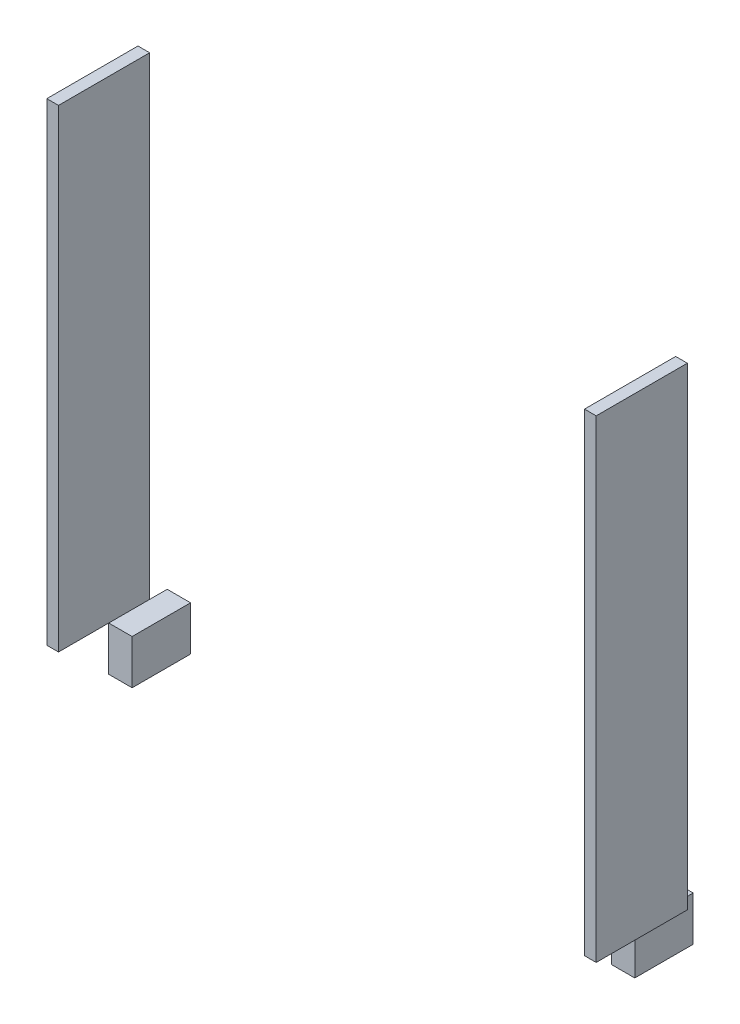
ISO-10303-21;
HEADER;
FILE_DESCRIPTION(('STEP AP214'),'2;1');
FILE_NAME('part.step','',(''),(''),'','','');
FILE_SCHEMA(('AUTOMOTIVE_DESIGN { 1 0 10303 214 1 1 1 1 }'));
ENDSEC;
DATA;
#1=APPLICATION_CONTEXT('core data for automotive mechanical design processes');
#2=APPLICATION_PROTOCOL_DEFINITION('international standard','automotive_design',2000,#1);
#3=PRODUCT_CONTEXT('',#1,'mechanical');
#4=PRODUCT('Part','Part','',(#3));
#5=PRODUCT_RELATED_PRODUCT_CATEGORY('part','',(#4));
#6=PRODUCT_DEFINITION_FORMATION('','',#4);
#7=PRODUCT_DEFINITION_CONTEXT('part definition',#1,'design');
#8=PRODUCT_DEFINITION('design','',#6,#7);
#9=PRODUCT_DEFINITION_SHAPE('','',#8);
#10=(LENGTH_UNIT() NAMED_UNIT(*) SI_UNIT(.MILLI.,.METRE.));
#11=(NAMED_UNIT(*) PLANE_ANGLE_UNIT() SI_UNIT($,.RADIAN.));
#12=(NAMED_UNIT(*) SI_UNIT($,.STERADIAN.) SOLID_ANGLE_UNIT());
#13=UNCERTAINTY_MEASURE_WITH_UNIT(LENGTH_MEASURE(1.E-05),#10,'distance_accuracy_value','');
#14=(GEOMETRIC_REPRESENTATION_CONTEXT(3) GLOBAL_UNCERTAINTY_ASSIGNED_CONTEXT((#13)) GLOBAL_UNIT_ASSIGNED_CONTEXT((#10,
#11,#12)) REPRESENTATION_CONTEXT('',''));
#15=CARTESIAN_POINT('',(0.,0.,0.));
#16=DIRECTION('',(0.,0.,1.));
#17=DIRECTION('',(1.,0.,0.));
#18=AXIS2_PLACEMENT_3D('',#15,#16,#17);
#19=CARTESIAN_POINT('',(205.,2.,335.));
#20=DIRECTION('',(1.,0.,0.));
#21=DIRECTION('',(0.,0.,-1.));
#22=AXIS2_PLACEMENT_3D('',#19,#20,#21);
#23=PLANE('',#22);
#24=DIRECTION('',(0.,-1.,0.));
#25=VECTOR('',#24,1.);
#26=CARTESIAN_POINT('',(205.,2.,285.));
#27=LINE('',#26,#25);
#28=CARTESIAN_POINT('',(205.,40.,285.));
#29=VERTEX_POINT('',#28);
#30=CARTESIAN_POINT('',(205.,2.,285.));
#31=VERTEX_POINT('',#30);
#32=EDGE_CURVE('E123',#29,#31,#27,.T.);
#33=ORIENTED_EDGE('',*,*,#32,.T.);
#34=DIRECTION('',(0.,0.,-1.));
#35=VECTOR('',#34,1.);
#36=CARTESIAN_POINT('',(205.,2.,335.));
#37=LINE('',#36,#35);
#38=CARTESIAN_POINT('',(205.,2.,335.));
#39=VERTEX_POINT('',#38);
#40=EDGE_CURVE('E12',#39,#31,#37,.T.);
#41=ORIENTED_EDGE('',*,*,#40,.F.);
#42=DIRECTION('',(0.,-1.,0.));
#43=VECTOR('',#42,1.);
#44=CARTESIAN_POINT('',(205.,2.,335.));
#45=LINE('',#44,#43);
#46=CARTESIAN_POINT('',(205.,40.,335.));
#47=VERTEX_POINT('',#46);
#48=EDGE_CURVE('E106',#47,#39,#45,.T.);
#49=ORIENTED_EDGE('',*,*,#48,.F.);
#50=DIRECTION('',(0.,0.,-1.));
#51=VECTOR('',#50,1.);
#52=CARTESIAN_POINT('',(205.,40.,335.));
#53=LINE('',#52,#51);
#54=EDGE_CURVE('E118',#47,#29,#53,.T.);
#55=ORIENTED_EDGE('',*,*,#54,.T.);
#56=EDGE_LOOP('',(#33,#41,#49,#55));
#57=FACE_BOUND('',#56,.T.);
#58=ADVANCED_FACE('F53',(#57),#23,.F.);
#59=CARTESIAN_POINT('',(205.,2.,335.));
#60=DIRECTION('',(0.,1.,0.));
#61=DIRECTION('',(0.,0.,1.));
#62=AXIS2_PLACEMENT_3D('',#59,#60,#61);
#63=PLANE('',#62);
#64=DIRECTION('',(1.,0.,0.));
#65=VECTOR('',#64,1.);
#66=CARTESIAN_POINT('',(205.,2.,285.));
#67=LINE('',#66,#65);
#68=CARTESIAN_POINT('',(225.,2.,285.));
#69=VERTEX_POINT('',#68);
#70=EDGE_CURVE('E112',#31,#69,#67,.T.);
#71=ORIENTED_EDGE('',*,*,#70,.T.);
#72=DIRECTION('',(0.,0.,-1.));
#73=VECTOR('',#72,1.);
#74=CARTESIAN_POINT('',(225.,2.,335.));
#75=LINE('',#74,#73);
#76=CARTESIAN_POINT('',(225.,2.,335.));
#77=VERTEX_POINT('',#76);
#78=EDGE_CURVE('E64',#77,#69,#75,.T.);
#79=ORIENTED_EDGE('',*,*,#78,.F.);
#80=DIRECTION('',(1.,0.,0.));
#81=VECTOR('',#80,1.);
#82=CARTESIAN_POINT('',(205.,2.,335.));
#83=LINE('',#82,#81);
#84=EDGE_CURVE('E101',#39,#77,#83,.T.);
#85=ORIENTED_EDGE('',*,*,#84,.F.);
#86=ORIENTED_EDGE('',*,*,#40,.T.);
#87=EDGE_LOOP('',(#71,#79,#85,#86));
#88=FACE_BOUND('',#87,.T.);
#89=ADVANCED_FACE('F109',(#88),#63,.F.);
#90=CARTESIAN_POINT('',(225.,2.,335.));
#91=DIRECTION('',(-1.,0.,0.));
#92=DIRECTION('',(0.,0.,1.));
#93=AXIS2_PLACEMENT_3D('',#90,#91,#92);
#94=PLANE('',#93);
#95=DIRECTION('',(0.,1.,0.));
#96=VECTOR('',#95,1.);
#97=CARTESIAN_POINT('',(225.,2.,285.));
#98=LINE('',#97,#96);
#99=CARTESIAN_POINT('',(225.,40.,285.));
#100=VERTEX_POINT('',#99);
#101=EDGE_CURVE('E86',#69,#100,#98,.T.);
#102=ORIENTED_EDGE('',*,*,#101,.T.);
#103=DIRECTION('',(0.,0.,-1.));
#104=VECTOR('',#103,1.);
#105=CARTESIAN_POINT('',(225.,40.,335.));
#106=LINE('',#105,#104);
#107=CARTESIAN_POINT('',(225.,40.,335.));
#108=VERTEX_POINT('',#107);
#109=EDGE_CURVE('E114',#108,#100,#106,.T.);
#110=ORIENTED_EDGE('',*,*,#109,.F.);
#111=DIRECTION('',(0.,1.,0.));
#112=VECTOR('',#111,1.);
#113=CARTESIAN_POINT('',(225.,2.,335.));
#114=LINE('',#113,#112);
#115=EDGE_CURVE('E102',#77,#108,#114,.T.);
#116=ORIENTED_EDGE('',*,*,#115,.F.);
#117=ORIENTED_EDGE('',*,*,#78,.T.);
#118=EDGE_LOOP('',(#102,#110,#116,#117));
#119=FACE_BOUND('',#118,.T.);
#120=ADVANCED_FACE('F111',(#119),#94,.F.);
#121=CARTESIAN_POINT('',(205.,40.,335.));
#122=DIRECTION('',(0.,-1.,0.));
#123=DIRECTION('',(0.,0.,-1.));
#124=AXIS2_PLACEMENT_3D('',#121,#122,#123);
#125=PLANE('',#124);
#126=DIRECTION('',(-1.,0.,0.));
#127=VECTOR('',#126,1.);
#128=CARTESIAN_POINT('',(205.,40.,285.));
#129=LINE('',#128,#127);
#130=EDGE_CURVE('E94',#100,#29,#129,.T.);
#131=ORIENTED_EDGE('',*,*,#130,.T.);
#132=ORIENTED_EDGE('',*,*,#54,.F.);
#133=DIRECTION('',(-1.,0.,0.));
#134=VECTOR('',#133,1.);
#135=CARTESIAN_POINT('',(205.,40.,335.));
#136=LINE('',#135,#134);
#137=EDGE_CURVE('E72',#108,#47,#136,.T.);
#138=ORIENTED_EDGE('',*,*,#137,.F.);
#139=ORIENTED_EDGE('',*,*,#109,.T.);
#140=EDGE_LOOP('',(#131,#132,#138,#139));
#141=FACE_BOUND('',#140,.T.);
#142=ADVANCED_FACE('F135',(#141),#125,.F.);
#143=CARTESIAN_POINT('',(0.,0.,335.));
#144=DIRECTION('',(0.,0.,-1.));
#145=DIRECTION('',(-1.,0.,0.));
#146=AXIS2_PLACEMENT_3D('',#143,#144,#145);
#147=PLANE('',#146);
#148=ORIENTED_EDGE('',*,*,#48,.T.);
#149=ORIENTED_EDGE('',*,*,#84,.T.);
#150=ORIENTED_EDGE('',*,*,#115,.T.);
#151=ORIENTED_EDGE('',*,*,#137,.T.);
#152=EDGE_LOOP('',(#148,#149,#150,#151));
#153=FACE_BOUND('',#152,.T.);
#154=ADVANCED_FACE('F105',(#153),#147,.F.);
#155=CARTESIAN_POINT('',(0.,0.,285.));
#156=DIRECTION('',(0.,0.,-1.));
#157=DIRECTION('',(-1.,0.,0.));
#158=AXIS2_PLACEMENT_3D('',#155,#156,#157);
#159=PLANE('',#158);
#160=ORIENTED_EDGE('',*,*,#32,.F.);
#161=ORIENTED_EDGE('',*,*,#130,.F.);
#162=ORIENTED_EDGE('',*,*,#101,.F.);
#163=ORIENTED_EDGE('',*,*,#70,.F.);
#164=EDGE_LOOP('',(#160,#161,#162,#163));
#165=FACE_BOUND('',#164,.T.);
#166=ADVANCED_FACE('F138',(#165),#159,.T.);
#167=CLOSED_SHELL('',(#58,#89,#120,#142,#154,#166));
#168=MANIFOLD_SOLID_BREP('B2',#167);
#169=CARTESIAN_POINT('',(-225.,2.,335.));
#170=DIRECTION('',(1.,0.,0.));
#171=DIRECTION('',(0.,0.,-1.));
#172=AXIS2_PLACEMENT_3D('',#169,#170,#171);
#173=PLANE('',#172);
#174=DIRECTION('',(0.,-1.,0.));
#175=VECTOR('',#174,1.);
#176=CARTESIAN_POINT('',(-225.,2.,285.));
#177=LINE('',#176,#175);
#178=CARTESIAN_POINT('',(-225.,40.,285.));
#179=VERTEX_POINT('',#178);
#180=CARTESIAN_POINT('',(-225.,2.,285.));
#181=VERTEX_POINT('',#180);
#182=EDGE_CURVE('E277',#179,#181,#177,.T.);
#183=ORIENTED_EDGE('',*,*,#182,.T.);
#184=DIRECTION('',(0.,0.,-1.));
#185=VECTOR('',#184,1.);
#186=CARTESIAN_POINT('',(-225.,2.,335.));
#187=LINE('',#186,#185);
#188=CARTESIAN_POINT('',(-225.,2.,335.));
#189=VERTEX_POINT('',#188);
#190=EDGE_CURVE('E55',#189,#181,#187,.T.);
#191=ORIENTED_EDGE('',*,*,#190,.F.);
#192=DIRECTION('',(0.,-1.,0.));
#193=VECTOR('',#192,1.);
#194=CARTESIAN_POINT('',(-225.,2.,335.));
#195=LINE('',#194,#193);
#196=CARTESIAN_POINT('',(-225.,40.,335.));
#197=VERTEX_POINT('',#196);
#198=EDGE_CURVE('E256',#197,#189,#195,.T.);
#199=ORIENTED_EDGE('',*,*,#198,.F.);
#200=DIRECTION('',(0.,0.,-1.));
#201=VECTOR('',#200,1.);
#202=CARTESIAN_POINT('',(-225.,40.,335.));
#203=LINE('',#202,#201);
#204=EDGE_CURVE('E275',#197,#179,#203,.T.);
#205=ORIENTED_EDGE('',*,*,#204,.T.);
#206=EDGE_LOOP('',(#183,#191,#199,#205));
#207=FACE_BOUND('',#206,.T.);
#208=ADVANCED_FACE('F206',(#207),#173,.F.);
#209=CARTESIAN_POINT('',(-225.,2.,335.));
#210=DIRECTION('',(0.,1.,0.));
#211=DIRECTION('',(0.,0.,1.));
#212=AXIS2_PLACEMENT_3D('',#209,#210,#211);
#213=PLANE('',#212);
#214=DIRECTION('',(1.,0.,0.));
#215=VECTOR('',#214,1.);
#216=CARTESIAN_POINT('',(-225.,2.,285.));
#217=LINE('',#216,#215);
#218=CARTESIAN_POINT('',(-205.,2.,285.));
#219=VERTEX_POINT('',#218);
#220=EDGE_CURVE('E263',#181,#219,#217,.T.);
#221=ORIENTED_EDGE('',*,*,#220,.T.);
#222=DIRECTION('',(0.,0.,-1.));
#223=VECTOR('',#222,1.);
#224=CARTESIAN_POINT('',(-205.,2.,335.));
#225=LINE('',#224,#223);
#226=CARTESIAN_POINT('',(-205.,2.,335.));
#227=VERTEX_POINT('',#226);
#228=EDGE_CURVE('E214',#227,#219,#225,.T.);
#229=ORIENTED_EDGE('',*,*,#228,.F.);
#230=DIRECTION('',(1.,0.,0.));
#231=VECTOR('',#230,1.);
#232=CARTESIAN_POINT('',(-225.,2.,335.));
#233=LINE('',#232,#231);
#234=EDGE_CURVE('E251',#189,#227,#233,.T.);
#235=ORIENTED_EDGE('',*,*,#234,.F.);
#236=ORIENTED_EDGE('',*,*,#190,.T.);
#237=EDGE_LOOP('',(#221,#229,#235,#236));
#238=FACE_BOUND('',#237,.T.);
#239=ADVANCED_FACE('F265',(#238),#213,.F.);
#240=CARTESIAN_POINT('',(-205.,2.,335.));
#241=DIRECTION('',(-1.,0.,0.));
#242=DIRECTION('',(0.,0.,1.));
#243=AXIS2_PLACEMENT_3D('',#240,#241,#242);
#244=PLANE('',#243);
#245=DIRECTION('',(0.,1.,0.));
#246=VECTOR('',#245,1.);
#247=CARTESIAN_POINT('',(-205.,2.,285.));
#248=LINE('',#247,#246);
#249=CARTESIAN_POINT('',(-205.,40.,285.));
#250=VERTEX_POINT('',#249);
#251=EDGE_CURVE('E238',#219,#250,#248,.T.);
#252=ORIENTED_EDGE('',*,*,#251,.T.);
#253=DIRECTION('',(0.,0.,-1.));
#254=VECTOR('',#253,1.);
#255=CARTESIAN_POINT('',(-205.,40.,335.));
#256=LINE('',#255,#254);
#257=CARTESIAN_POINT('',(-205.,40.,335.));
#258=VERTEX_POINT('',#257);
#259=EDGE_CURVE('E264',#258,#250,#256,.T.);
#260=ORIENTED_EDGE('',*,*,#259,.F.);
#261=DIRECTION('',(0.,1.,0.));
#262=VECTOR('',#261,1.);
#263=CARTESIAN_POINT('',(-205.,2.,335.));
#264=LINE('',#263,#262);
#265=EDGE_CURVE('E258',#227,#258,#264,.T.);
#266=ORIENTED_EDGE('',*,*,#265,.F.);
#267=ORIENTED_EDGE('',*,*,#228,.T.);
#268=EDGE_LOOP('',(#252,#260,#266,#267));
#269=FACE_BOUND('',#268,.T.);
#270=ADVANCED_FACE('F266',(#269),#244,.F.);
#271=CARTESIAN_POINT('',(-225.,40.,335.));
#272=DIRECTION('',(0.,-1.,0.));
#273=DIRECTION('',(0.,0.,-1.));
#274=AXIS2_PLACEMENT_3D('',#271,#272,#273);
#275=PLANE('',#274);
#276=DIRECTION('',(-1.,0.,0.));
#277=VECTOR('',#276,1.);
#278=CARTESIAN_POINT('',(-225.,40.,285.));
#279=LINE('',#278,#277);
#280=EDGE_CURVE('E247',#250,#179,#279,.T.);
#281=ORIENTED_EDGE('',*,*,#280,.T.);
#282=ORIENTED_EDGE('',*,*,#204,.F.);
#283=DIRECTION('',(-1.,0.,0.));
#284=VECTOR('',#283,1.);
#285=CARTESIAN_POINT('',(-225.,40.,335.));
#286=LINE('',#285,#284);
#287=EDGE_CURVE('E224',#258,#197,#286,.T.);
#288=ORIENTED_EDGE('',*,*,#287,.F.);
#289=ORIENTED_EDGE('',*,*,#259,.T.);
#290=EDGE_LOOP('',(#281,#282,#288,#289));
#291=FACE_BOUND('',#290,.T.);
#292=ADVANCED_FACE('F288',(#291),#275,.F.);
#293=CARTESIAN_POINT('',(0.,0.,335.));
#294=DIRECTION('',(0.,0.,-1.));
#295=DIRECTION('',(-1.,0.,0.));
#296=AXIS2_PLACEMENT_3D('',#293,#294,#295);
#297=PLANE('',#296);
#298=ORIENTED_EDGE('',*,*,#198,.T.);
#299=ORIENTED_EDGE('',*,*,#234,.T.);
#300=ORIENTED_EDGE('',*,*,#265,.T.);
#301=ORIENTED_EDGE('',*,*,#287,.T.);
#302=EDGE_LOOP('',(#298,#299,#300,#301));
#303=FACE_BOUND('',#302,.T.);
#304=ADVANCED_FACE('F255',(#303),#297,.F.);
#305=CARTESIAN_POINT('',(0.,0.,285.));
#306=DIRECTION('',(0.,0.,-1.));
#307=DIRECTION('',(-1.,0.,0.));
#308=AXIS2_PLACEMENT_3D('',#305,#306,#307);
#309=PLANE('',#308);
#310=ORIENTED_EDGE('',*,*,#182,.F.);
#311=ORIENTED_EDGE('',*,*,#280,.F.);
#312=ORIENTED_EDGE('',*,*,#251,.F.);
#313=ORIENTED_EDGE('',*,*,#220,.F.);
#314=EDGE_LOOP('',(#310,#311,#312,#313));
#315=FACE_BOUND('',#314,.T.);
#316=ADVANCED_FACE('F292',(#315),#309,.T.);
#317=CLOSED_SHELL('',(#208,#239,#270,#292,#304,#316));
#318=MANIFOLD_SOLID_BREP('B6',#317);
#319=CARTESIAN_POINT('',(225.,40.,378.));
#320=DIRECTION('',(1.,0.,0.));
#321=DIRECTION('',(0.,0.,-1.));
#322=AXIS2_PLACEMENT_3D('',#319,#320,#321);
#323=PLANE('',#322);
#324=DIRECTION('',(0.,-1.,0.));
#325=VECTOR('',#324,1.);
#326=CARTESIAN_POINT('',(225.,40.,300.));
#327=LINE('',#326,#325);
#328=CARTESIAN_POINT('',(225.,445.,300.));
#329=VERTEX_POINT('',#328);
#330=CARTESIAN_POINT('',(225.,40.,300.));
#331=VERTEX_POINT('',#330);
#332=EDGE_CURVE('E426',#329,#331,#327,.T.);
#333=ORIENTED_EDGE('',*,*,#332,.T.);
#334=DIRECTION('',(0.,0.,-1.));
#335=VECTOR('',#334,1.);
#336=CARTESIAN_POINT('',(225.,40.,378.));
#337=LINE('',#336,#335);
#338=CARTESIAN_POINT('',(225.,40.,378.));
#339=VERTEX_POINT('',#338);
#340=EDGE_CURVE('E204',#339,#331,#337,.T.);
#341=ORIENTED_EDGE('',*,*,#340,.F.);
#342=DIRECTION('',(0.,-1.,0.));
#343=VECTOR('',#342,1.);
#344=CARTESIAN_POINT('',(225.,40.,378.));
#345=LINE('',#344,#343);
#346=CARTESIAN_POINT('',(225.,445.,378.));
#347=VERTEX_POINT('',#346);
#348=EDGE_CURVE('E408',#347,#339,#345,.T.);
#349=ORIENTED_EDGE('',*,*,#348,.F.);
#350=DIRECTION('',(0.,0.,-1.));
#351=VECTOR('',#350,1.);
#352=CARTESIAN_POINT('',(225.,445.,378.));
#353=LINE('',#352,#351);
#354=EDGE_CURVE('E425',#347,#329,#353,.T.);
#355=ORIENTED_EDGE('',*,*,#354,.T.);
#356=EDGE_LOOP('',(#333,#341,#349,#355));
#357=FACE_BOUND('',#356,.T.);
#358=ADVANCED_FACE('F360',(#357),#323,.F.);
#359=CARTESIAN_POINT('',(225.,40.,378.));
#360=DIRECTION('',(0.,1.,0.));
#361=DIRECTION('',(0.,0.,1.));
#362=AXIS2_PLACEMENT_3D('',#359,#360,#361);
#363=PLANE('',#362);
#364=DIRECTION('',(1.,0.,0.));
#365=VECTOR('',#364,1.);
#366=CARTESIAN_POINT('',(225.,40.,300.));
#367=LINE('',#366,#365);
#368=CARTESIAN_POINT('',(235.,40.,300.));
#369=VERTEX_POINT('',#368);
#370=EDGE_CURVE('E414',#331,#369,#367,.T.);
#371=ORIENTED_EDGE('',*,*,#370,.T.);
#372=DIRECTION('',(0.,0.,-1.));
#373=VECTOR('',#372,1.);
#374=CARTESIAN_POINT('',(235.,40.,378.));
#375=LINE('',#374,#373);
#376=CARTESIAN_POINT('',(235.,40.,378.));
#377=VERTEX_POINT('',#376);
#378=EDGE_CURVE('E368',#377,#369,#375,.T.);
#379=ORIENTED_EDGE('',*,*,#378,.F.);
#380=DIRECTION('',(1.,0.,0.));
#381=VECTOR('',#380,1.);
#382=CARTESIAN_POINT('',(225.,40.,378.));
#383=LINE('',#382,#381);
#384=EDGE_CURVE('E404',#339,#377,#383,.T.);
#385=ORIENTED_EDGE('',*,*,#384,.F.);
#386=ORIENTED_EDGE('',*,*,#340,.T.);
#387=EDGE_LOOP('',(#371,#379,#385,#386));
#388=FACE_BOUND('',#387,.T.);
#389=ADVANCED_FACE('F413',(#388),#363,.F.);
#390=CARTESIAN_POINT('',(235.,40.,378.));
#391=DIRECTION('',(-1.,0.,0.));
#392=DIRECTION('',(0.,0.,1.));
#393=AXIS2_PLACEMENT_3D('',#390,#391,#392);
#394=PLANE('',#393);
#395=DIRECTION('',(0.,1.,0.));
#396=VECTOR('',#395,1.);
#397=CARTESIAN_POINT('',(235.,40.,300.));
#398=LINE('',#397,#396);
#399=CARTESIAN_POINT('',(235.,445.,300.));
#400=VERTEX_POINT('',#399);
#401=EDGE_CURVE('E391',#369,#400,#398,.T.);
#402=ORIENTED_EDGE('',*,*,#401,.T.);
#403=DIRECTION('',(0.,0.,-1.));
#404=VECTOR('',#403,1.);
#405=CARTESIAN_POINT('',(235.,445.,378.));
#406=LINE('',#405,#404);
#407=CARTESIAN_POINT('',(235.,445.,378.));
#408=VERTEX_POINT('',#407);
#409=EDGE_CURVE('E418',#408,#400,#406,.T.);
#410=ORIENTED_EDGE('',*,*,#409,.F.);
#411=DIRECTION('',(0.,1.,0.));
#412=VECTOR('',#411,1.);
#413=CARTESIAN_POINT('',(235.,40.,378.));
#414=LINE('',#413,#412);
#415=EDGE_CURVE('E407',#377,#408,#414,.T.);
#416=ORIENTED_EDGE('',*,*,#415,.F.);
#417=ORIENTED_EDGE('',*,*,#378,.T.);
#418=EDGE_LOOP('',(#402,#410,#416,#417));
#419=FACE_BOUND('',#418,.T.);
#420=ADVANCED_FACE('F417',(#419),#394,.F.);
#421=CARTESIAN_POINT('',(225.,445.,378.));
#422=DIRECTION('',(0.,-1.,0.));
#423=DIRECTION('',(0.,0.,-1.));
#424=AXIS2_PLACEMENT_3D('',#421,#422,#423);
#425=PLANE('',#424);
#426=DIRECTION('',(-1.,0.,0.));
#427=VECTOR('',#426,1.);
#428=CARTESIAN_POINT('',(225.,445.,300.));
#429=LINE('',#428,#427);
#430=EDGE_CURVE('E400',#400,#329,#429,.T.);
#431=ORIENTED_EDGE('',*,*,#430,.T.);
#432=ORIENTED_EDGE('',*,*,#354,.F.);
#433=DIRECTION('',(-1.,0.,0.));
#434=VECTOR('',#433,1.);
#435=CARTESIAN_POINT('',(225.,445.,378.));
#436=LINE('',#435,#434);
#437=EDGE_CURVE('E372',#408,#347,#436,.T.);
#438=ORIENTED_EDGE('',*,*,#437,.F.);
#439=ORIENTED_EDGE('',*,*,#409,.T.);
#440=EDGE_LOOP('',(#431,#432,#438,#439));
#441=FACE_BOUND('',#440,.T.);
#442=ADVANCED_FACE('F437',(#441),#425,.F.);
#443=CARTESIAN_POINT('',(0.,0.,378.));
#444=DIRECTION('',(0.,0.,-1.));
#445=DIRECTION('',(-1.,0.,0.));
#446=AXIS2_PLACEMENT_3D('',#443,#444,#445);
#447=PLANE('',#446);
#448=ORIENTED_EDGE('',*,*,#348,.T.);
#449=ORIENTED_EDGE('',*,*,#384,.T.);
#450=ORIENTED_EDGE('',*,*,#415,.T.);
#451=ORIENTED_EDGE('',*,*,#437,.T.);
#452=EDGE_LOOP('',(#448,#449,#450,#451));
#453=FACE_BOUND('',#452,.T.);
#454=ADVANCED_FACE('F403',(#453),#447,.F.);
#455=CARTESIAN_POINT('',(0.,0.,300.));
#456=DIRECTION('',(0.,0.,-1.));
#457=DIRECTION('',(-1.,0.,0.));
#458=AXIS2_PLACEMENT_3D('',#455,#456,#457);
#459=PLANE('',#458);
#460=ORIENTED_EDGE('',*,*,#332,.F.);
#461=ORIENTED_EDGE('',*,*,#430,.F.);
#462=ORIENTED_EDGE('',*,*,#401,.F.);
#463=ORIENTED_EDGE('',*,*,#370,.F.);
#464=EDGE_LOOP('',(#460,#461,#462,#463));
#465=FACE_BOUND('',#464,.T.);
#466=ADVANCED_FACE('F442',(#465),#459,.T.);
#467=CLOSED_SHELL('',(#358,#389,#420,#442,#454,#466));
#468=MANIFOLD_SOLID_BREP('B46',#467);
#469=CARTESIAN_POINT('',(-235.,40.,378.));
#470=DIRECTION('',(1.,0.,0.));
#471=DIRECTION('',(0.,0.,-1.));
#472=AXIS2_PLACEMENT_3D('',#469,#470,#471);
#473=PLANE('',#472);
#474=DIRECTION('',(0.,-1.,0.));
#475=VECTOR('',#474,1.);
#476=CARTESIAN_POINT('',(-235.,40.,300.));
#477=LINE('',#476,#475);
#478=CARTESIAN_POINT('',(-235.,445.,300.));
#479=VERTEX_POINT('',#478);
#480=CARTESIAN_POINT('',(-235.,40.,300.));
#481=VERTEX_POINT('',#480);
#482=EDGE_CURVE('E566',#479,#481,#477,.T.);
#483=ORIENTED_EDGE('',*,*,#482,.T.);
#484=DIRECTION('',(0.,0.,-1.));
#485=VECTOR('',#484,1.);
#486=CARTESIAN_POINT('',(-235.,40.,378.));
#487=LINE('',#486,#485);
#488=CARTESIAN_POINT('',(-235.,40.,378.));
#489=VERTEX_POINT('',#488);
#490=EDGE_CURVE('E355',#489,#481,#487,.T.);
#491=ORIENTED_EDGE('',*,*,#490,.F.);
#492=DIRECTION('',(0.,-1.,0.));
#493=VECTOR('',#492,1.);
#494=CARTESIAN_POINT('',(-235.,40.,378.));
#495=LINE('',#494,#493);
#496=CARTESIAN_POINT('',(-235.,445.,378.));
#497=VERTEX_POINT('',#496);
#498=EDGE_CURVE('E552',#497,#489,#495,.T.);
#499=ORIENTED_EDGE('',*,*,#498,.F.);
#500=DIRECTION('',(0.,0.,-1.));
#501=VECTOR('',#500,1.);
#502=CARTESIAN_POINT('',(-235.,445.,378.));
#503=LINE('',#502,#501);
#504=EDGE_CURVE('E564',#497,#479,#503,.T.);
#505=ORIENTED_EDGE('',*,*,#504,.T.);
#506=EDGE_LOOP('',(#483,#491,#499,#505));
#507=FACE_BOUND('',#506,.T.);
#508=ADVANCED_FACE('F496',(#507),#473,.F.);
#509=CARTESIAN_POINT('',(-235.,40.,378.));
#510=DIRECTION('',(0.,1.,0.));
#511=DIRECTION('',(0.,0.,1.));
#512=AXIS2_PLACEMENT_3D('',#509,#510,#511);
#513=PLANE('',#512);
#514=DIRECTION('',(1.,0.,0.));
#515=VECTOR('',#514,1.);
#516=CARTESIAN_POINT('',(-235.,40.,300.));
#517=LINE('',#516,#515);
#518=CARTESIAN_POINT('',(-225.,40.,300.));
#519=VERTEX_POINT('',#518);
#520=EDGE_CURVE('E556',#481,#519,#517,.T.);
#521=ORIENTED_EDGE('',*,*,#520,.T.);
#522=DIRECTION('',(0.,0.,-1.));
#523=VECTOR('',#522,1.);
#524=CARTESIAN_POINT('',(-225.,40.,378.));
#525=LINE('',#524,#523);
#526=CARTESIAN_POINT('',(-225.,40.,378.));
#527=VERTEX_POINT('',#526);
#528=EDGE_CURVE('E508',#527,#519,#525,.T.);
#529=ORIENTED_EDGE('',*,*,#528,.F.);
#530=DIRECTION('',(1.,0.,0.));
#531=VECTOR('',#530,1.);
#532=CARTESIAN_POINT('',(-235.,40.,378.));
#533=LINE('',#532,#531);
#534=EDGE_CURVE('E546',#489,#527,#533,.T.);
#535=ORIENTED_EDGE('',*,*,#534,.F.);
#536=ORIENTED_EDGE('',*,*,#490,.T.);
#537=EDGE_LOOP('',(#521,#529,#535,#536));
#538=FACE_BOUND('',#537,.T.);
#539=ADVANCED_FACE('F553',(#538),#513,.F.);
#540=CARTESIAN_POINT('',(-225.,40.,378.));
#541=DIRECTION('',(-1.,0.,0.));
#542=DIRECTION('',(0.,0.,1.));
#543=AXIS2_PLACEMENT_3D('',#540,#541,#542);
#544=PLANE('',#543);
#545=DIRECTION('',(0.,1.,0.));
#546=VECTOR('',#545,1.);
#547=CARTESIAN_POINT('',(-225.,40.,300.));
#548=LINE('',#547,#546);
#549=CARTESIAN_POINT('',(-225.,445.,300.));
#550=VERTEX_POINT('',#549);
#551=EDGE_CURVE('E531',#519,#550,#548,.T.);
#552=ORIENTED_EDGE('',*,*,#551,.T.);
#553=DIRECTION('',(0.,0.,-1.));
#554=VECTOR('',#553,1.);
#555=CARTESIAN_POINT('',(-225.,445.,378.));
#556=LINE('',#555,#554);
#557=CARTESIAN_POINT('',(-225.,445.,378.));
#558=VERTEX_POINT('',#557);
#559=EDGE_CURVE('E559',#558,#550,#556,.T.);
#560=ORIENTED_EDGE('',*,*,#559,.F.);
#561=DIRECTION('',(0.,1.,0.));
#562=VECTOR('',#561,1.);
#563=CARTESIAN_POINT('',(-225.,40.,378.));
#564=LINE('',#563,#562);
#565=EDGE_CURVE('E548',#527,#558,#564,.T.);
#566=ORIENTED_EDGE('',*,*,#565,.F.);
#567=ORIENTED_EDGE('',*,*,#528,.T.);
#568=EDGE_LOOP('',(#552,#560,#566,#567));
#569=FACE_BOUND('',#568,.T.);
#570=ADVANCED_FACE('F558',(#569),#544,.F.);
#571=CARTESIAN_POINT('',(-235.,445.,378.));
#572=DIRECTION('',(0.,-1.,0.));
#573=DIRECTION('',(0.,0.,-1.));
#574=AXIS2_PLACEMENT_3D('',#571,#572,#573);
#575=PLANE('',#574);
#576=DIRECTION('',(-1.,0.,0.));
#577=VECTOR('',#576,1.);
#578=CARTESIAN_POINT('',(-235.,445.,300.));
#579=LINE('',#578,#577);
#580=EDGE_CURVE('E537',#550,#479,#579,.T.);
#581=ORIENTED_EDGE('',*,*,#580,.T.);
#582=ORIENTED_EDGE('',*,*,#504,.F.);
#583=DIRECTION('',(-1.,0.,0.));
#584=VECTOR('',#583,1.);
#585=CARTESIAN_POINT('',(-235.,445.,378.));
#586=LINE('',#585,#584);
#587=EDGE_CURVE('E516',#558,#497,#586,.T.);
#588=ORIENTED_EDGE('',*,*,#587,.F.);
#589=ORIENTED_EDGE('',*,*,#559,.T.);
#590=EDGE_LOOP('',(#581,#582,#588,#589));
#591=FACE_BOUND('',#590,.T.);
#592=ADVANCED_FACE('F583',(#591),#575,.F.);
#593=CARTESIAN_POINT('',(0.,0.,378.));
#594=DIRECTION('',(0.,0.,-1.));
#595=DIRECTION('',(-1.,0.,0.));
#596=AXIS2_PLACEMENT_3D('',#593,#594,#595);
#597=PLANE('',#596);
#598=ORIENTED_EDGE('',*,*,#498,.T.);
#599=ORIENTED_EDGE('',*,*,#534,.T.);
#600=ORIENTED_EDGE('',*,*,#565,.T.);
#601=ORIENTED_EDGE('',*,*,#587,.T.);
#602=EDGE_LOOP('',(#598,#599,#600,#601));
#603=FACE_BOUND('',#602,.T.);
#604=ADVANCED_FACE('F550',(#603),#597,.F.);
#605=CARTESIAN_POINT('',(0.,0.,300.));
#606=DIRECTION('',(0.,0.,-1.));
#607=DIRECTION('',(-1.,0.,0.));
#608=AXIS2_PLACEMENT_3D('',#605,#606,#607);
#609=PLANE('',#608);
#610=ORIENTED_EDGE('',*,*,#482,.F.);
#611=ORIENTED_EDGE('',*,*,#580,.F.);
#612=ORIENTED_EDGE('',*,*,#551,.F.);
#613=ORIENTED_EDGE('',*,*,#520,.F.);
#614=EDGE_LOOP('',(#610,#611,#612,#613));
#615=FACE_BOUND('',#614,.T.);
#616=ADVANCED_FACE('F585',(#615),#609,.T.);
#617=CLOSED_SHELL('',(#508,#539,#570,#592,#604,#616));
#618=MANIFOLD_SOLID_BREP('B196',#617);
#619=ADVANCED_BREP_SHAPE_REPRESENTATION('',(#18,#168,#318,#468,#618),#14);
#620=SHAPE_DEFINITION_REPRESENTATION(#9,#619);
ENDSEC;
END-ISO-10303-21;
